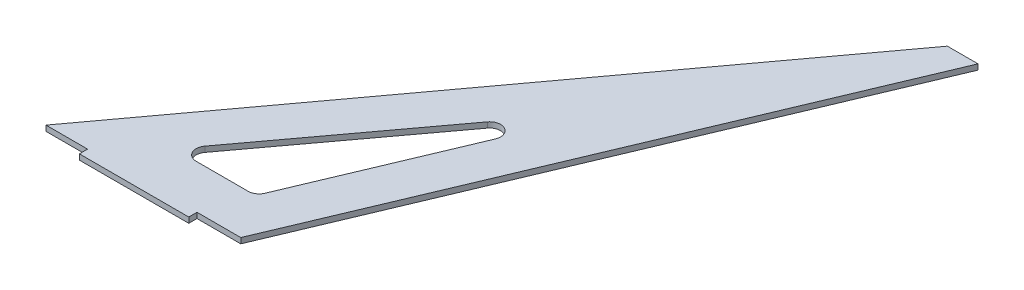
ISO-10303-21;
HEADER;
FILE_DESCRIPTION(('STEP AP214'),'2;1');
FILE_NAME('part.step','',(''),(''),'','','');
FILE_SCHEMA(('AUTOMOTIVE_DESIGN { 1 0 10303 214 1 1 1 1 }'));
ENDSEC;
DATA;
#1=APPLICATION_CONTEXT('core data for automotive mechanical design processes');
#2=APPLICATION_PROTOCOL_DEFINITION('international standard','automotive_design',2000,#1);
#3=PRODUCT_CONTEXT('',#1,'mechanical');
#4=PRODUCT('Part','Part','',(#3));
#5=PRODUCT_RELATED_PRODUCT_CATEGORY('part','',(#4));
#6=PRODUCT_DEFINITION_FORMATION('','',#4);
#7=PRODUCT_DEFINITION_CONTEXT('part definition',#1,'design');
#8=PRODUCT_DEFINITION('design','',#6,#7);
#9=PRODUCT_DEFINITION_SHAPE('','',#8);
#10=(LENGTH_UNIT() NAMED_UNIT(*) SI_UNIT(.MILLI.,.METRE.));
#11=(NAMED_UNIT(*) PLANE_ANGLE_UNIT() SI_UNIT($,.RADIAN.));
#12=(NAMED_UNIT(*) SI_UNIT($,.STERADIAN.) SOLID_ANGLE_UNIT());
#13=UNCERTAINTY_MEASURE_WITH_UNIT(LENGTH_MEASURE(1.E-05),#10,'distance_accuracy_value','');
#14=(GEOMETRIC_REPRESENTATION_CONTEXT(3) GLOBAL_UNCERTAINTY_ASSIGNED_CONTEXT((#13)) GLOBAL_UNIT_ASSIGNED_CONTEXT((#10,
#11,#12)) REPRESENTATION_CONTEXT('',''));
#15=CARTESIAN_POINT('',(0.,0.,0.));
#16=DIRECTION('',(0.,0.,1.));
#17=DIRECTION('',(1.,0.,0.));
#18=AXIS2_PLACEMENT_3D('',#15,#16,#17);
#19=CARTESIAN_POINT('',(-240.93131737506,3.175,0.));
#20=DIRECTION('',(0.,0.,-1.));
#21=DIRECTION('',(-1.,0.,0.));
#22=AXIS2_PLACEMENT_3D('',#19,#20,#21);
#23=PLANE('',#22);
#24=DIRECTION('',(0.,1.,0.));
#25=VECTOR('',#24,1.);
#26=CARTESIAN_POINT('',(-152.03131737506,3.175,0.));
#27=LINE('',#26,#25);
#28=CARTESIAN_POINT('',(-152.03131737506,0.,0.));
#29=VERTEX_POINT('',#28);
#30=CARTESIAN_POINT('',(-152.03131737506,3.175,0.));
#31=VERTEX_POINT('',#30);
#32=EDGE_CURVE('E157',#29,#31,#27,.T.);
#33=ORIENTED_EDGE('',*,*,#32,.F.);
#34=DIRECTION('',(1.,0.,0.));
#35=VECTOR('',#34,1.);
#36=CARTESIAN_POINT('',(-240.93131737506,0.,0.));
#37=LINE('',#36,#35);
#38=CARTESIAN_POINT('',(-126.63131737506,0.,0.));
#39=VERTEX_POINT('',#38);
#40=EDGE_CURVE('E166',#29,#39,#37,.T.);
#41=ORIENTED_EDGE('',*,*,#40,.T.);
#42=DIRECTION('',(0.,-1.,0.));
#43=VECTOR('',#42,1.);
#44=CARTESIAN_POINT('',(-126.63131737506,3.175,0.));
#45=LINE('',#44,#43);
#46=CARTESIAN_POINT('',(-126.63131737506,3.175,0.));
#47=VERTEX_POINT('',#46);
#48=EDGE_CURVE('E177',#47,#39,#45,.T.);
#49=ORIENTED_EDGE('',*,*,#48,.F.);
#50=DIRECTION('',(1.,0.,0.));
#51=VECTOR('',#50,1.);
#52=CARTESIAN_POINT('',(-240.93131737506,3.175,0.));
#53=LINE('',#52,#51);
#54=EDGE_CURVE('E54',#31,#47,#53,.T.);
#55=ORIENTED_EDGE('',*,*,#54,.F.);
#56=EDGE_LOOP('',(#33,#41,#49,#55));
#57=FACE_BOUND('',#56,.T.);
#58=ADVANCED_FACE('F38',(#57),#23,.F.);
#59=CARTESIAN_POINT('',(-239.66131737506,3.175,0.));
#60=VERTEX_POINT('',#59);
#61=CARTESIAN_POINT('',(-215.53131737506,3.175,0.));
#62=VERTEX_POINT('',#61);
#63=EDGE_CURVE('E62',#60,#62,#53,.T.);
#64=ORIENTED_EDGE('',*,*,#63,.F.);
#65=DIRECTION('',(0.,1.,0.));
#66=VECTOR('',#65,1.);
#67=CARTESIAN_POINT('',(-239.66131737506,0.,0.));
#68=LINE('',#67,#66);
#69=CARTESIAN_POINT('',(-239.66131737506,0.,0.));
#70=VERTEX_POINT('',#69);
#71=EDGE_CURVE('E143',#70,#60,#68,.T.);
#72=ORIENTED_EDGE('',*,*,#71,.F.);
#73=CARTESIAN_POINT('',(-215.53131737506,0.,0.));
#74=VERTEX_POINT('',#73);
#75=EDGE_CURVE('E154',#70,#74,#37,.T.);
#76=ORIENTED_EDGE('',*,*,#75,.T.);
#77=DIRECTION('',(0.,-1.,0.));
#78=VECTOR('',#77,1.);
#79=CARTESIAN_POINT('',(-215.53131737506,3.175,0.));
#80=LINE('',#79,#78);
#81=EDGE_CURVE('E300',#62,#74,#80,.T.);
#82=ORIENTED_EDGE('',*,*,#81,.F.);
#83=EDGE_LOOP('',(#64,#72,#76,#82));
#84=FACE_BOUND('',#83,.T.);
#85=ADVANCED_FACE('F153',(#84),#23,.F.);
#86=CARTESIAN_POINT('',(-126.63131737506,3.175,0.));
#87=DIRECTION('',(-0.921863151588502,0.,-0.3875155864521));
#88=DIRECTION('',(-0.387515586452101,0.,0.921863151588502));
#89=AXIS2_PLACEMENT_3D('',#86,#87,#88);
#90=PLANE('',#89);
#91=DIRECTION('',(0.3875155864521,0.,-0.921863151588502));
#92=VECTOR('',#91,1.);
#93=CARTESIAN_POINT('',(-126.63131737506,0.,0.));
#94=LINE('',#93,#92);
#95=CARTESIAN_POINT('',(0.,0.,-301.244));
#96=VERTEX_POINT('',#95);
#97=EDGE_CURVE('E261',#39,#96,#94,.T.);
#98=ORIENTED_EDGE('',*,*,#97,.T.);
#99=DIRECTION('',(0.,-1.,0.));
#100=VECTOR('',#99,1.);
#101=CARTESIAN_POINT('',(0.,3.175,-301.244));
#102=LINE('',#101,#100);
#103=CARTESIAN_POINT('',(0.,3.175,-301.244));
#104=VERTEX_POINT('',#103);
#105=EDGE_CURVE('E183',#104,#96,#102,.T.);
#106=ORIENTED_EDGE('',*,*,#105,.F.);
#107=DIRECTION('',(0.3875155864521,0.,-0.921863151588502));
#108=VECTOR('',#107,1.);
#109=CARTESIAN_POINT('',(-126.63131737506,3.175,0.));
#110=LINE('',#109,#108);
#111=EDGE_CURVE('E165',#47,#104,#110,.T.);
#112=ORIENTED_EDGE('',*,*,#111,.F.);
#113=ORIENTED_EDGE('',*,*,#48,.T.);
#114=EDGE_LOOP('',(#98,#106,#112,#113));
#115=FACE_BOUND('',#114,.T.);
#116=ADVANCED_FACE('F321',(#115),#90,.F.);
#117=CARTESIAN_POINT('',(0.,3.175,-301.244));
#118=DIRECTION('',(0.,0.,1.));
#119=DIRECTION('',(1.,0.,0.));
#120=AXIS2_PLACEMENT_3D('',#117,#118,#119);
#121=PLANE('',#120);
#122=DIRECTION('',(-1.,0.,0.));
#123=VECTOR('',#122,1.);
#124=CARTESIAN_POINT('',(0.,0.,-301.244));
#125=LINE('',#124,#123);
#126=CARTESIAN_POINT('',(-17.78,0.,-301.244));
#127=VERTEX_POINT('',#126);
#128=EDGE_CURVE('E173',#96,#127,#125,.T.);
#129=ORIENTED_EDGE('',*,*,#128,.T.);
#130=DIRECTION('',(0.,-1.,0.));
#131=VECTOR('',#130,1.);
#132=CARTESIAN_POINT('',(-17.78,3.175,-301.244));
#133=LINE('',#132,#131);
#134=CARTESIAN_POINT('',(-17.78,3.175,-301.244));
#135=VERTEX_POINT('',#134);
#136=EDGE_CURVE('E145',#135,#127,#133,.T.);
#137=ORIENTED_EDGE('',*,*,#136,.F.);
#138=DIRECTION('',(-1.,0.,0.));
#139=VECTOR('',#138,1.);
#140=CARTESIAN_POINT('',(0.,3.175,-301.244));
#141=LINE('',#140,#139);
#142=EDGE_CURVE('E171',#104,#135,#141,.T.);
#143=ORIENTED_EDGE('',*,*,#142,.F.);
#144=ORIENTED_EDGE('',*,*,#105,.T.);
#145=EDGE_LOOP('',(#129,#137,#143,#144));
#146=FACE_BOUND('',#145,.T.);
#147=ADVANCED_FACE('F278',(#146),#121,.F.);
#148=CARTESIAN_POINT('',(0.,3.175,0.));
#149=DIRECTION('',(0.,1.,0.));
#150=DIRECTION('',(0.,0.,1.));
#151=AXIS2_PLACEMENT_3D('',#148,#149,#150);
#152=PLANE('',#151);
#153=DIRECTION('',(0.593046679985423,0.,-0.805168078948903));
#154=VECTOR('',#153,1.);
#155=CARTESIAN_POINT('',(-17.78,3.175,-301.244));
#156=LINE('',#155,#154);
#157=EDGE_CURVE('E150',#60,#135,#156,.T.);
#158=ORIENTED_EDGE('',*,*,#157,.F.);
#159=ORIENTED_EDGE('',*,*,#63,.T.);
#160=DIRECTION('',(0.,0.,-1.));
#161=VECTOR('',#160,1.);
#162=CARTESIAN_POINT('',(-215.53131737506,3.175,4.7625));
#163=LINE('',#162,#161);
#164=CARTESIAN_POINT('',(-215.53131737506,3.175,4.7625));
#165=VERTEX_POINT('',#164);
#166=EDGE_CURVE('E295',#165,#62,#163,.T.);
#167=ORIENTED_EDGE('',*,*,#166,.F.);
#168=DIRECTION('',(-1.,0.,0.));
#169=VECTOR('',#168,1.);
#170=CARTESIAN_POINT('',(-215.53131737506,3.175,4.7625));
#171=LINE('',#170,#169);
#172=CARTESIAN_POINT('',(-152.03131737506,3.175,4.7625));
#173=VERTEX_POINT('',#172);
#174=EDGE_CURVE('E307',#173,#165,#171,.T.);
#175=ORIENTED_EDGE('',*,*,#174,.F.);
#176=DIRECTION('',(0.,0.,-1.));
#177=VECTOR('',#176,1.);
#178=CARTESIAN_POINT('',(-152.03131737506,3.175,4.7625));
#179=LINE('',#178,#177);
#180=EDGE_CURVE('E256',#173,#31,#179,.T.);
#181=ORIENTED_EDGE('',*,*,#180,.T.);
#182=ORIENTED_EDGE('',*,*,#54,.T.);
#183=ORIENTED_EDGE('',*,*,#111,.T.);
#184=ORIENTED_EDGE('',*,*,#142,.T.);
#185=EDGE_LOOP('',(#158,#159,#167,#175,#181,#182,#183,#184));
#186=FACE_BOUND('',#185,.T.);
#187=DIRECTION('',(1.,0.,0.));
#188=VECTOR('',#187,1.);
#189=CARTESIAN_POINT('',(-190.506029631638,3.175,-25.4));
#190=LINE('',#189,#188);
#191=CARTESIAN_POINT('',(-177.899707695782,3.175,-25.4));
#192=VERTEX_POINT('',#191);
#193=CARTESIAN_POINT('',(-147.725966940602,3.175,-25.4));
#194=VERTEX_POINT('',#193);
#195=EDGE_CURVE('E227',#192,#194,#190,.T.);
#196=ORIENTED_EDGE('',*,*,#195,.F.);
#197=CARTESIAN_POINT('',(-177.899707695782,3.175,-31.75));
#198=DIRECTION('',(0.,1.,0.));
#199=DIRECTION('',(0.,0.,1.));
#200=AXIS2_PLACEMENT_3D('',#197,#198,#199);
#201=CIRCLE('',#200,6.35);
#202=CARTESIAN_POINT('',(-183.002234190506,3.175,-35.5297782171227));
#203=VERTEX_POINT('',#202);
#204=EDGE_CURVE('E47',#192,#203,#201,.F.);
#205=ORIENTED_EDGE('',*,*,#204,.T.);
#206=DIRECTION('',(-0.595240664113808,0.,0.803547479484164));
#207=VECTOR('',#206,1.);
#208=CARTESIAN_POINT('',(-81.8457818600314,3.175,-172.086329548723));
#209=LINE('',#208,#207);
#210=CARTESIAN_POINT('',(-113.241459225194,3.175,-129.703611205658));
#211=VERTEX_POINT('',#210);
#212=EDGE_CURVE('E225',#211,#203,#209,.T.);
#213=ORIENTED_EDGE('',*,*,#212,.F.);
#214=CARTESIAN_POINT('',(-108.13893273047,3.175,-125.923832988535));
#215=DIRECTION('',(0.,1.,0.));
#216=DIRECTION('',(0.,0.,1.));
#217=AXIS2_PLACEMENT_3D('',#214,#215,#216);
#218=CIRCLE('',#217,6.35);
#219=CARTESIAN_POINT('',(-102.285101717883,3.175,-123.463109014564));
#220=VERTEX_POINT('',#219);
#221=EDGE_CURVE('E208',#211,#220,#218,.F.);
#222=ORIENTED_EDGE('',*,*,#221,.T.);
#223=DIRECTION('',(0.387515586452101,0.,-0.921863151588501));
#224=VECTOR('',#223,1.);
#225=CARTESIAN_POINT('',(-143.507037027494,3.175,-25.4));
#226=LINE('',#225,#224);
#227=CARTESIAN_POINT('',(-141.872135928015,3.175,-29.2892760260292));
#228=VERTEX_POINT('',#227);
#229=EDGE_CURVE('E238',#228,#220,#226,.T.);
#230=ORIENTED_EDGE('',*,*,#229,.F.);
#231=CARTESIAN_POINT('',(-147.725966940602,3.175,-31.75));
#232=DIRECTION('',(0.,1.,0.));
#233=DIRECTION('',(0.,0.,1.));
#234=AXIS2_PLACEMENT_3D('',#231,#232,#233);
#235=CIRCLE('',#234,6.35);
#236=EDGE_CURVE('E214',#228,#194,#235,.F.);
#237=ORIENTED_EDGE('',*,*,#236,.T.);
#238=EDGE_LOOP('',(#196,#205,#213,#222,#230,#237));
#239=FACE_BOUND('',#238,.T.);
#240=ADVANCED_FACE('F224',(#186,#239),#152,.T.);
#241=CARTESIAN_POINT('',(0.,0.,0.));
#242=DIRECTION('',(0.,1.,0.));
#243=DIRECTION('',(0.,0.,1.));
#244=AXIS2_PLACEMENT_3D('',#241,#242,#243);
#245=PLANE('',#244);
#246=DIRECTION('',(0.387515586452101,0.,-0.921863151588501));
#247=VECTOR('',#246,1.);
#248=CARTESIAN_POINT('',(-143.507037027494,0.,-25.4));
#249=LINE('',#248,#247);
#250=CARTESIAN_POINT('',(-141.872135928015,0.,-29.2892760260292));
#251=VERTEX_POINT('',#250);
#252=CARTESIAN_POINT('',(-102.285101717883,0.,-123.463109014564));
#253=VERTEX_POINT('',#252);
#254=EDGE_CURVE('E251',#251,#253,#249,.T.);
#255=ORIENTED_EDGE('',*,*,#254,.T.);
#256=CARTESIAN_POINT('',(-108.13893273047,0.,-125.923832988535));
#257=DIRECTION('',(0.,1.,0.));
#258=DIRECTION('',(0.,0.,1.));
#259=AXIS2_PLACEMENT_3D('',#256,#257,#258);
#260=CIRCLE('',#259,6.35);
#261=CARTESIAN_POINT('',(-113.241459225194,0.,-129.703611205658));
#262=VERTEX_POINT('',#261);
#263=EDGE_CURVE('E211',#253,#262,#260,.T.);
#264=ORIENTED_EDGE('',*,*,#263,.T.);
#265=DIRECTION('',(-0.595240664113808,0.,0.803547479484164));
#266=VECTOR('',#265,1.);
#267=CARTESIAN_POINT('',(-81.8457818600314,0.,-172.086329548723));
#268=LINE('',#267,#266);
#269=CARTESIAN_POINT('',(-183.002234190506,0.,-35.5297782171227));
#270=VERTEX_POINT('',#269);
#271=EDGE_CURVE('E246',#262,#270,#268,.T.);
#272=ORIENTED_EDGE('',*,*,#271,.T.);
#273=CARTESIAN_POINT('',(-177.899707695782,0.,-31.75));
#274=DIRECTION('',(0.,1.,0.));
#275=DIRECTION('',(0.,0.,1.));
#276=AXIS2_PLACEMENT_3D('',#273,#274,#275);
#277=CIRCLE('',#276,6.35);
#278=CARTESIAN_POINT('',(-177.899707695782,0.,-25.4));
#279=VERTEX_POINT('',#278);
#280=EDGE_CURVE('E11',#270,#279,#277,.T.);
#281=ORIENTED_EDGE('',*,*,#280,.T.);
#282=DIRECTION('',(1.,0.,0.));
#283=VECTOR('',#282,1.);
#284=CARTESIAN_POINT('',(-190.506029631638,0.,-25.4));
#285=LINE('',#284,#283);
#286=CARTESIAN_POINT('',(-147.725966940602,0.,-25.4));
#287=VERTEX_POINT('',#286);
#288=EDGE_CURVE('E237',#279,#287,#285,.T.);
#289=ORIENTED_EDGE('',*,*,#288,.T.);
#290=CARTESIAN_POINT('',(-147.725966940602,0.,-31.75));
#291=DIRECTION('',(0.,1.,0.));
#292=DIRECTION('',(0.,0.,1.));
#293=AXIS2_PLACEMENT_3D('',#290,#291,#292);
#294=CIRCLE('',#293,6.35);
#295=EDGE_CURVE('E217',#287,#251,#294,.T.);
#296=ORIENTED_EDGE('',*,*,#295,.T.);
#297=EDGE_LOOP('',(#255,#264,#272,#281,#289,#296));
#298=FACE_BOUND('',#297,.T.);
#299=ORIENTED_EDGE('',*,*,#75,.F.);
#300=DIRECTION('',(0.593046679985423,0.,-0.805168078948903));
#301=VECTOR('',#300,1.);
#302=CARTESIAN_POINT('',(-17.78,0.,-301.244));
#303=LINE('',#302,#301);
#304=EDGE_CURVE('E140',#70,#127,#303,.T.);
#305=ORIENTED_EDGE('',*,*,#304,.T.);
#306=ORIENTED_EDGE('',*,*,#128,.F.);
#307=ORIENTED_EDGE('',*,*,#97,.F.);
#308=ORIENTED_EDGE('',*,*,#40,.F.);
#309=DIRECTION('',(0.,0.,-1.));
#310=VECTOR('',#309,1.);
#311=CARTESIAN_POINT('',(-152.03131737506,0.,4.7625));
#312=LINE('',#311,#310);
#313=CARTESIAN_POINT('',(-152.03131737506,0.,4.7625));
#314=VERTEX_POINT('',#313);
#315=EDGE_CURVE('E282',#314,#29,#312,.T.);
#316=ORIENTED_EDGE('',*,*,#315,.F.);
#317=DIRECTION('',(1.,0.,0.));
#318=VECTOR('',#317,1.);
#319=CARTESIAN_POINT('',(-215.53131737506,0.,4.7625));
#320=LINE('',#319,#318);
#321=CARTESIAN_POINT('',(-215.53131737506,0.,4.7625));
#322=VERTEX_POINT('',#321);
#323=EDGE_CURVE('E291',#322,#314,#320,.T.);
#324=ORIENTED_EDGE('',*,*,#323,.F.);
#325=DIRECTION('',(0.,0.,-1.));
#326=VECTOR('',#325,1.);
#327=CARTESIAN_POINT('',(-215.53131737506,0.,4.7625));
#328=LINE('',#327,#326);
#329=EDGE_CURVE('E163',#322,#74,#328,.T.);
#330=ORIENTED_EDGE('',*,*,#329,.T.);
#331=EDGE_LOOP('',(#299,#305,#306,#307,#308,#316,#324,#330));
#332=FACE_BOUND('',#331,.T.);
#333=ADVANCED_FACE('F160',(#298,#332),#245,.F.);
#334=CARTESIAN_POINT('',(-190.506029631638,0.,-25.4));
#335=DIRECTION('',(0.,0.,1.));
#336=DIRECTION('',(1.,0.,0.));
#337=AXIS2_PLACEMENT_3D('',#334,#335,#336);
#338=PLANE('',#337);
#339=ORIENTED_EDGE('',*,*,#195,.T.);
#340=DIRECTION('',(0.,1.,0.));
#341=VECTOR('',#340,1.);
#342=CARTESIAN_POINT('',(-147.725966940602,0.,-25.4));
#343=LINE('',#342,#341);
#344=EDGE_CURVE('E205',#194,#287,#343,.F.);
#345=ORIENTED_EDGE('',*,*,#344,.T.);
#346=ORIENTED_EDGE('',*,*,#288,.F.);
#347=DIRECTION('',(0.,1.,0.));
#348=VECTOR('',#347,1.);
#349=CARTESIAN_POINT('',(-177.899707695782,3.175,-25.4));
#350=LINE('',#349,#348);
#351=EDGE_CURVE('E201',#279,#192,#350,.T.);
#352=ORIENTED_EDGE('',*,*,#351,.T.);
#353=EDGE_LOOP('',(#339,#345,#346,#352));
#354=FACE_BOUND('',#353,.T.);
#355=ADVANCED_FACE('F248',(#354),#338,.F.);
#356=CARTESIAN_POINT('',(-81.8457818600314,0.,-172.086329548723));
#357=DIRECTION('',(-0.803547479484164,0.,-0.595240664113808));
#358=DIRECTION('',(-0.595240664113808,0.,0.803547479484164));
#359=AXIS2_PLACEMENT_3D('',#356,#357,#358);
#360=PLANE('',#359);
#361=ORIENTED_EDGE('',*,*,#271,.F.);
#362=DIRECTION('',(0.,1.,0.));
#363=VECTOR('',#362,1.);
#364=CARTESIAN_POINT('',(-113.241459225194,3.175,-129.703611205658));
#365=LINE('',#364,#363);
#366=EDGE_CURVE('E190',#262,#211,#365,.T.);
#367=ORIENTED_EDGE('',*,*,#366,.T.);
#368=ORIENTED_EDGE('',*,*,#212,.T.);
#369=DIRECTION('',(0.,1.,0.));
#370=VECTOR('',#369,1.);
#371=CARTESIAN_POINT('',(-183.002234190506,0.,-35.5297782171227));
#372=LINE('',#371,#370);
#373=EDGE_CURVE('E187',#203,#270,#372,.F.);
#374=ORIENTED_EDGE('',*,*,#373,.T.);
#375=EDGE_LOOP('',(#361,#367,#368,#374));
#376=FACE_BOUND('',#375,.T.);
#377=ADVANCED_FACE('F233',(#376),#360,.F.);
#378=CARTESIAN_POINT('',(-143.507037027494,0.,-25.4));
#379=DIRECTION('',(0.921863151588501,0.,0.387515586452101));
#380=DIRECTION('',(0.387515586452101,0.,-0.921863151588501));
#381=AXIS2_PLACEMENT_3D('',#378,#379,#380);
#382=PLANE('',#381);
#383=ORIENTED_EDGE('',*,*,#229,.T.);
#384=DIRECTION('',(0.,1.,0.));
#385=VECTOR('',#384,1.);
#386=CARTESIAN_POINT('',(-102.285101717883,0.,-123.463109014564));
#387=LINE('',#386,#385);
#388=EDGE_CURVE('E198',#220,#253,#387,.F.);
#389=ORIENTED_EDGE('',*,*,#388,.T.);
#390=ORIENTED_EDGE('',*,*,#254,.F.);
#391=DIRECTION('',(0.,1.,0.));
#392=VECTOR('',#391,1.);
#393=CARTESIAN_POINT('',(-141.872135928015,3.175,-29.2892760260292));
#394=LINE('',#393,#392);
#395=EDGE_CURVE('E194',#251,#228,#394,.T.);
#396=ORIENTED_EDGE('',*,*,#395,.T.);
#397=EDGE_LOOP('',(#383,#389,#390,#396));
#398=FACE_BOUND('',#397,.T.);
#399=ADVANCED_FACE('F341',(#398),#382,.F.);
#400=CARTESIAN_POINT('',(-108.13893273047,0.,-125.923832988535));
#401=DIRECTION('',(0.,-1.,0.));
#402=DIRECTION('',(0.,0.,-1.));
#403=AXIS2_PLACEMENT_3D('',#400,#401,#402);
#404=CYLINDRICAL_SURFACE('',#403,6.35);
#405=ORIENTED_EDGE('',*,*,#263,.F.);
#406=ORIENTED_EDGE('',*,*,#388,.F.);
#407=ORIENTED_EDGE('',*,*,#221,.F.);
#408=ORIENTED_EDGE('',*,*,#366,.F.);
#409=EDGE_LOOP('',(#405,#406,#407,#408));
#410=FACE_BOUND('',#409,.T.);
#411=ADVANCED_FACE('F344',(#410),#404,.F.);
#412=CARTESIAN_POINT('',(-147.725966940602,0.,-31.75));
#413=DIRECTION('',(0.,-1.,0.));
#414=DIRECTION('',(0.,0.,-1.));
#415=AXIS2_PLACEMENT_3D('',#412,#413,#414);
#416=CYLINDRICAL_SURFACE('',#415,6.35);
#417=ORIENTED_EDGE('',*,*,#295,.F.);
#418=ORIENTED_EDGE('',*,*,#344,.F.);
#419=ORIENTED_EDGE('',*,*,#236,.F.);
#420=ORIENTED_EDGE('',*,*,#395,.F.);
#421=EDGE_LOOP('',(#417,#418,#419,#420));
#422=FACE_BOUND('',#421,.T.);
#423=ADVANCED_FACE('F378',(#422),#416,.F.);
#424=CARTESIAN_POINT('',(-177.899707695782,0.,-31.75));
#425=DIRECTION('',(0.,-1.,0.));
#426=DIRECTION('',(0.,0.,-1.));
#427=AXIS2_PLACEMENT_3D('',#424,#425,#426);
#428=CYLINDRICAL_SURFACE('',#427,6.35);
#429=ORIENTED_EDGE('',*,*,#280,.F.);
#430=ORIENTED_EDGE('',*,*,#373,.F.);
#431=ORIENTED_EDGE('',*,*,#204,.F.);
#432=ORIENTED_EDGE('',*,*,#351,.F.);
#433=EDGE_LOOP('',(#429,#430,#431,#432));
#434=FACE_BOUND('',#433,.T.);
#435=ADVANCED_FACE('F40',(#434),#428,.F.);
#436=CARTESIAN_POINT('',(-152.03131737506,3.175,4.7625));
#437=DIRECTION('',(-1.,0.,0.));
#438=DIRECTION('',(0.,0.,1.));
#439=AXIS2_PLACEMENT_3D('',#436,#437,#438);
#440=PLANE('',#439);
#441=ORIENTED_EDGE('',*,*,#32,.T.);
#442=ORIENTED_EDGE('',*,*,#180,.F.);
#443=DIRECTION('',(0.,1.,0.));
#444=VECTOR('',#443,1.);
#445=CARTESIAN_POINT('',(-152.03131737506,3.175,4.7625));
#446=LINE('',#445,#444);
#447=EDGE_CURVE('E289',#314,#173,#446,.T.);
#448=ORIENTED_EDGE('',*,*,#447,.F.);
#449=ORIENTED_EDGE('',*,*,#315,.T.);
#450=EDGE_LOOP('',(#441,#442,#448,#449));
#451=FACE_BOUND('',#450,.T.);
#452=ADVANCED_FACE('F286',(#451),#440,.F.);
#453=CARTESIAN_POINT('',(-215.53131737506,3.175,4.7625));
#454=DIRECTION('',(1.,0.,0.));
#455=DIRECTION('',(0.,0.,-1.));
#456=AXIS2_PLACEMENT_3D('',#453,#454,#455);
#457=PLANE('',#456);
#458=ORIENTED_EDGE('',*,*,#81,.T.);
#459=ORIENTED_EDGE('',*,*,#329,.F.);
#460=DIRECTION('',(0.,-1.,0.));
#461=VECTOR('',#460,1.);
#462=CARTESIAN_POINT('',(-215.53131737506,3.175,4.7625));
#463=LINE('',#462,#461);
#464=EDGE_CURVE('E297',#165,#322,#463,.T.);
#465=ORIENTED_EDGE('',*,*,#464,.F.);
#466=ORIENTED_EDGE('',*,*,#166,.T.);
#467=EDGE_LOOP('',(#458,#459,#465,#466));
#468=FACE_BOUND('',#467,.T.);
#469=ADVANCED_FACE('F350',(#468),#457,.F.);
#470=CARTESIAN_POINT('',(0.,0.,4.7625));
#471=DIRECTION('',(0.,0.,1.));
#472=DIRECTION('',(1.,0.,0.));
#473=AXIS2_PLACEMENT_3D('',#470,#471,#472);
#474=PLANE('',#473);
#475=ORIENTED_EDGE('',*,*,#447,.T.);
#476=ORIENTED_EDGE('',*,*,#174,.T.);
#477=ORIENTED_EDGE('',*,*,#464,.T.);
#478=ORIENTED_EDGE('',*,*,#323,.T.);
#479=EDGE_LOOP('',(#475,#476,#477,#478));
#480=FACE_BOUND('',#479,.T.);
#481=ADVANCED_FACE('F311',(#480),#474,.T.);
#482=CARTESIAN_POINT('',(-17.78,0.,-301.244));
#483=DIRECTION('',(0.805168078948903,0.,0.593046679985423));
#484=DIRECTION('',(0.593046679985423,0.,-0.805168078948903));
#485=AXIS2_PLACEMENT_3D('',#482,#483,#484);
#486=PLANE('',#485);
#487=ORIENTED_EDGE('',*,*,#157,.T.);
#488=ORIENTED_EDGE('',*,*,#136,.T.);
#489=ORIENTED_EDGE('',*,*,#304,.F.);
#490=ORIENTED_EDGE('',*,*,#71,.T.);
#491=EDGE_LOOP('',(#487,#488,#489,#490));
#492=FACE_BOUND('',#491,.T.);
#493=ADVANCED_FACE('F142',(#492),#486,.F.);
#494=CLOSED_SHELL('',(#58,#85,#116,#147,#240,#333,#355,#377,#399,#411,#423,#435,#452,#469,#481,#493));
#495=MANIFOLD_SOLID_BREP('B2',#494);
#496=ADVANCED_BREP_SHAPE_REPRESENTATION('',(#18,#495),#14);
#497=SHAPE_DEFINITION_REPRESENTATION(#9,#496);
ENDSEC;
END-ISO-10303-21;
